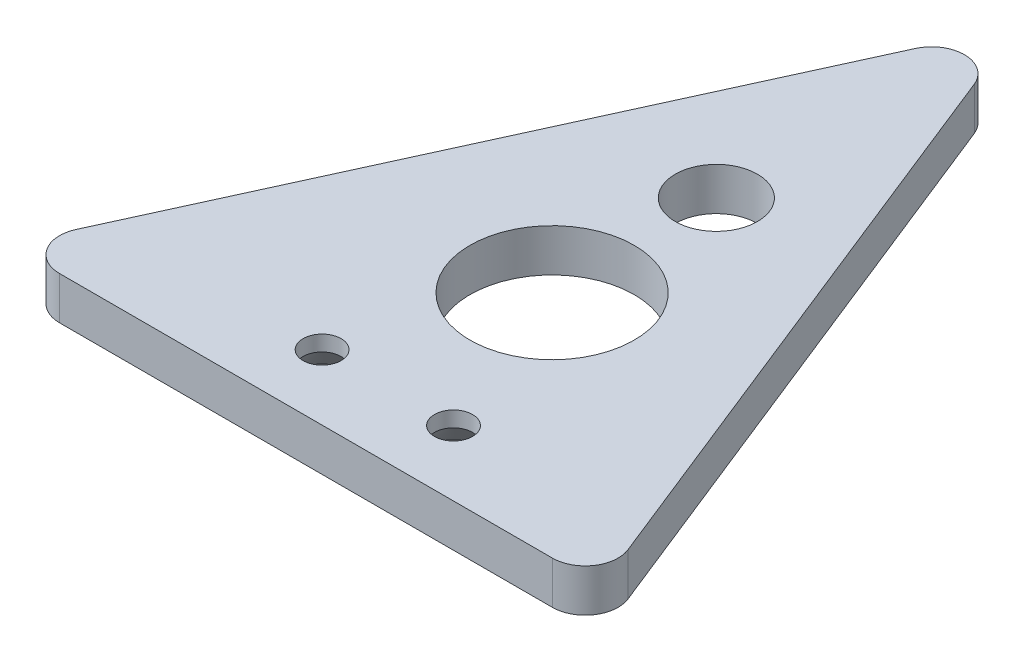
ISO-10303-21;
HEADER;
FILE_DESCRIPTION(('STEP AP214'),'2;1');
FILE_NAME('part.step','',(''),(''),'','','');
FILE_SCHEMA(('AUTOMOTIVE_DESIGN { 1 0 10303 214 1 1 1 1 }'));
ENDSEC;
DATA;
#1=APPLICATION_CONTEXT('core data for automotive mechanical design processes');
#2=APPLICATION_PROTOCOL_DEFINITION('international standard','automotive_design',2000,#1);
#3=PRODUCT_CONTEXT('',#1,'mechanical');
#4=PRODUCT('Part','Part','',(#3));
#5=PRODUCT_RELATED_PRODUCT_CATEGORY('part','',(#4));
#6=PRODUCT_DEFINITION_FORMATION('','',#4);
#7=PRODUCT_DEFINITION_CONTEXT('part definition',#1,'design');
#8=PRODUCT_DEFINITION('design','',#6,#7);
#9=PRODUCT_DEFINITION_SHAPE('','',#8);
#10=(LENGTH_UNIT() NAMED_UNIT(*) SI_UNIT(.MILLI.,.METRE.));
#11=(NAMED_UNIT(*) PLANE_ANGLE_UNIT() SI_UNIT($,.RADIAN.));
#12=(NAMED_UNIT(*) SI_UNIT($,.STERADIAN.) SOLID_ANGLE_UNIT());
#13=UNCERTAINTY_MEASURE_WITH_UNIT(LENGTH_MEASURE(1.E-05),#10,'distance_accuracy_value','');
#14=(GEOMETRIC_REPRESENTATION_CONTEXT(3) GLOBAL_UNCERTAINTY_ASSIGNED_CONTEXT((#13)) GLOBAL_UNIT_ASSIGNED_CONTEXT((#10,
#11,#12)) REPRESENTATION_CONTEXT('',''));
#15=CARTESIAN_POINT('',(0.,0.,0.));
#16=DIRECTION('',(0.,0.,1.));
#17=DIRECTION('',(1.,0.,0.));
#18=AXIS2_PLACEMENT_3D('',#15,#16,#17);
#19=CARTESIAN_POINT('',(-15.24,3.302,2.51460000000001));
#20=DIRECTION('',(0.,-1.,0.));
#21=DIRECTION('',(0.,0.,-1.));
#22=AXIS2_PLACEMENT_3D('',#19,#20,#21);
#23=PLANE('',#22);
#24=CARTESIAN_POINT('',(5.08,3.302,-25.4));
#25=DIRECTION('',(0.,-1.,0.));
#26=DIRECTION('',(0.,0.,-1.));
#27=AXIS2_PLACEMENT_3D('',#24,#25,#26);
#28=CIRCLE('',#27,3.175);
#29=CARTESIAN_POINT('',(5.08,3.302,-28.575));
#30=VERTEX_POINT('',#29);
#31=EDGE_CURVE('E187',#30,#30,#28,.T.);
#32=ORIENTED_EDGE('',*,*,#31,.T.);
#33=EDGE_LOOP('',(#32));
#34=FACE_BOUND('',#33,.T.);
#35=CARTESIAN_POINT('',(5.08,3.302,-12.7));
#36=DIRECTION('',(0.,-1.,0.));
#37=DIRECTION('',(0.,0.,-1.));
#38=AXIS2_PLACEMENT_3D('',#35,#36,#37);
#39=CIRCLE('',#38,6.35);
#40=CARTESIAN_POINT('',(5.08,3.302,-19.05));
#41=VERTEX_POINT('',#40);
#42=EDGE_CURVE('E195',#41,#41,#39,.T.);
#43=ORIENTED_EDGE('',*,*,#42,.T.);
#44=EDGE_LOOP('',(#43));
#45=FACE_BOUND('',#44,.T.);
#46=CARTESIAN_POINT('',(0.,3.302,0.));
#47=DIRECTION('',(0.,-1.,0.));
#48=DIRECTION('',(0.,0.,-1.));
#49=AXIS2_PLACEMENT_3D('',#46,#47,#48);
#50=CIRCLE('',#49,1.4732);
#51=CARTESIAN_POINT('',(0.,3.302,-1.4732));
#52=VERTEX_POINT('',#51);
#53=EDGE_CURVE('E206',#52,#52,#50,.T.);
#54=ORIENTED_EDGE('',*,*,#53,.T.);
#55=EDGE_LOOP('',(#54));
#56=FACE_BOUND('',#55,.T.);
#57=CARTESIAN_POINT('',(10.16,3.302,0.));
#58=DIRECTION('',(0.,-1.,0.));
#59=DIRECTION('',(0.,0.,-1.));
#60=AXIS2_PLACEMENT_3D('',#57,#58,#59);
#61=CIRCLE('',#60,1.4732);
#62=CARTESIAN_POINT('',(10.16,3.302,-1.4732));
#63=VERTEX_POINT('',#62);
#64=EDGE_CURVE('E122',#63,#63,#61,.T.);
#65=ORIENTED_EDGE('',*,*,#64,.T.);
#66=EDGE_LOOP('',(#65));
#67=FACE_BOUND('',#66,.T.);
#68=CARTESIAN_POINT('',(-15.24,3.302,2.51460000000001));
#69=DIRECTION('',(0.,1.,0.));
#70=DIRECTION('',(0.,0.,-1.));
#71=AXIS2_PLACEMENT_3D('',#68,#69,#70);
#72=CIRCLE('',#71,2.54);
#73=CARTESIAN_POINT('',(-17.5509752921642,3.302,1.46056337871648));
#74=VERTEX_POINT('',#73);
#75=CARTESIAN_POINT('',(-15.24,3.302,5.05460000000001));
#76=VERTEX_POINT('',#75);
#77=EDGE_CURVE('E129',#74,#76,#72,.T.);
#78=ORIENTED_EDGE('',*,*,#77,.T.);
#79=DIRECTION('',(1.,0.,0.));
#80=VECTOR('',#79,1.);
#81=CARTESIAN_POINT('',(22.86,3.302,5.05460000000001));
#82=LINE('',#81,#80);
#83=CARTESIAN_POINT('',(22.86,3.302,5.05460000000001));
#84=VERTEX_POINT('',#83);
#85=EDGE_CURVE('E88',#76,#84,#82,.T.);
#86=ORIENTED_EDGE('',*,*,#85,.T.);
#87=CARTESIAN_POINT('',(22.86,3.302,2.51460000000001));
#88=DIRECTION('',(0.,1.,0.));
#89=DIRECTION('',(0.,0.,-1.));
#90=AXIS2_PLACEMENT_3D('',#87,#88,#89);
#91=CIRCLE('',#90,2.54);
#92=CARTESIAN_POINT('',(25.2190721159599,3.302,1.57312310081419));
#93=VERTEX_POINT('',#92);
#94=EDGE_CURVE('E100',#84,#93,#91,.T.);
#95=ORIENTED_EDGE('',*,*,#94,.T.);
#96=DIRECTION('',(-0.370660196529849,0.,-0.928768549590507));
#97=VECTOR('',#96,1.);
#98=CARTESIAN_POINT('',(7.43907211595989,3.302,-42.9784768991858));
#99=LINE('',#98,#97);
#100=CARTESIAN_POINT('',(7.43907211595989,3.302,-42.9784768991858));
#101=VERTEX_POINT('',#100);
#102=EDGE_CURVE('E95',#93,#101,#99,.T.);
#103=ORIENTED_EDGE('',*,*,#102,.T.);
#104=CARTESIAN_POINT('',(5.08,3.302,-42.037));
#105=DIRECTION('',(0.,1.,0.));
#106=DIRECTION('',(0.,0.,1.));
#107=AXIS2_PLACEMENT_3D('',#104,#105,#106);
#108=CIRCLE('',#107,2.54000000000001);
#109=CARTESIAN_POINT('',(2.76902470783584,3.302,-43.0910366212835));
#110=VERTEX_POINT('',#109);
#111=EDGE_CURVE('E98',#101,#110,#108,.T.);
#112=ORIENTED_EDGE('',*,*,#111,.T.);
#113=DIRECTION('',(-0.414975047749423,0.,0.909832792190611));
#114=VECTOR('',#113,1.);
#115=CARTESIAN_POINT('',(-17.5509752921642,3.302,1.46056337871648));
#116=LINE('',#115,#114);
#117=EDGE_CURVE('E51',#110,#74,#116,.T.);
#118=ORIENTED_EDGE('',*,*,#117,.T.);
#119=EDGE_LOOP('',(#78,#86,#95,#103,#112,#118));
#120=FACE_BOUND('',#119,.T.);
#121=ADVANCED_FACE('F34',(#34,#45,#56,#67,#120),#23,.F.);
#122=CARTESIAN_POINT('',(-15.24,0.,2.51460000000001));
#123=DIRECTION('',(0.,-1.,0.));
#124=DIRECTION('',(0.,0.,-1.));
#125=AXIS2_PLACEMENT_3D('',#122,#123,#124);
#126=PLANE('',#125);
#127=CARTESIAN_POINT('',(5.08,0.,-25.4));
#128=DIRECTION('',(0.,-1.,0.));
#129=DIRECTION('',(0.,0.,-1.));
#130=AXIS2_PLACEMENT_3D('',#127,#128,#129);
#131=CIRCLE('',#130,3.175);
#132=CARTESIAN_POINT('',(5.08,0.,-28.575));
#133=VERTEX_POINT('',#132);
#134=EDGE_CURVE('E190',#133,#133,#131,.T.);
#135=ORIENTED_EDGE('',*,*,#134,.F.);
#136=EDGE_LOOP('',(#135));
#137=FACE_BOUND('',#136,.T.);
#138=CARTESIAN_POINT('',(5.08,0.,-12.7));
#139=DIRECTION('',(0.,-1.,0.));
#140=DIRECTION('',(0.,0.,-1.));
#141=AXIS2_PLACEMENT_3D('',#138,#139,#140);
#142=CIRCLE('',#141,6.35);
#143=CARTESIAN_POINT('',(5.08,0.,-19.05));
#144=VERTEX_POINT('',#143);
#145=EDGE_CURVE('E192',#144,#144,#142,.T.);
#146=ORIENTED_EDGE('',*,*,#145,.F.);
#147=EDGE_LOOP('',(#146));
#148=FACE_BOUND('',#147,.T.);
#149=CARTESIAN_POINT('',(0.,0.,0.));
#150=DIRECTION('',(0.,-1.,0.));
#151=DIRECTION('',(0.,0.,-1.));
#152=AXIS2_PLACEMENT_3D('',#149,#150,#151);
#153=CIRCLE('',#152,3.302);
#154=CARTESIAN_POINT('',(0.,0.,-3.302));
#155=VERTEX_POINT('',#154);
#156=EDGE_CURVE('E198',#155,#155,#153,.T.);
#157=ORIENTED_EDGE('',*,*,#156,.F.);
#158=EDGE_LOOP('',(#157));
#159=FACE_BOUND('',#158,.T.);
#160=CARTESIAN_POINT('',(10.16,0.,0.));
#161=DIRECTION('',(0.,-1.,0.));
#162=DIRECTION('',(0.,0.,-1.));
#163=AXIS2_PLACEMENT_3D('',#160,#161,#162);
#164=CIRCLE('',#163,3.302);
#165=CARTESIAN_POINT('',(10.16,0.,-3.302));
#166=VERTEX_POINT('',#165);
#167=EDGE_CURVE('E209',#166,#166,#164,.T.);
#168=ORIENTED_EDGE('',*,*,#167,.F.);
#169=EDGE_LOOP('',(#168));
#170=FACE_BOUND('',#169,.T.);
#171=CARTESIAN_POINT('',(-15.24,0.,2.51460000000001));
#172=DIRECTION('',(0.,1.,0.));
#173=DIRECTION('',(0.,0.,-1.));
#174=AXIS2_PLACEMENT_3D('',#171,#172,#173);
#175=CIRCLE('',#174,2.54);
#176=CARTESIAN_POINT('',(-17.5509752921642,0.,1.46056337871648));
#177=VERTEX_POINT('',#176);
#178=CARTESIAN_POINT('',(-15.24,0.,5.05460000000001));
#179=VERTEX_POINT('',#178);
#180=EDGE_CURVE('E118',#177,#179,#175,.T.);
#181=ORIENTED_EDGE('',*,*,#180,.F.);
#182=DIRECTION('',(-0.414975047749423,0.,0.909832792190611));
#183=VECTOR('',#182,1.);
#184=CARTESIAN_POINT('',(-17.5509752921642,0.,1.46056337871648));
#185=LINE('',#184,#183);
#186=CARTESIAN_POINT('',(2.76902470783584,0.,-43.0910366212835));
#187=VERTEX_POINT('',#186);
#188=EDGE_CURVE('E80',#187,#177,#185,.T.);
#189=ORIENTED_EDGE('',*,*,#188,.F.);
#190=CARTESIAN_POINT('',(5.08,0.,-42.037));
#191=DIRECTION('',(0.,1.,0.));
#192=DIRECTION('',(0.,0.,1.));
#193=AXIS2_PLACEMENT_3D('',#190,#191,#192);
#194=CIRCLE('',#193,2.54000000000001);
#195=CARTESIAN_POINT('',(7.43907211595989,0.,-42.9784768991858));
#196=VERTEX_POINT('',#195);
#197=EDGE_CURVE('E74',#196,#187,#194,.T.);
#198=ORIENTED_EDGE('',*,*,#197,.F.);
#199=DIRECTION('',(-0.370660196529849,0.,-0.928768549590507));
#200=VECTOR('',#199,1.);
#201=CARTESIAN_POINT('',(7.43907211595989,0.,-42.9784768991858));
#202=LINE('',#201,#200);
#203=CARTESIAN_POINT('',(25.2190721159599,0.,1.57312310081419));
#204=VERTEX_POINT('',#203);
#205=EDGE_CURVE('E108',#204,#196,#202,.T.);
#206=ORIENTED_EDGE('',*,*,#205,.F.);
#207=CARTESIAN_POINT('',(22.86,0.,2.51460000000001));
#208=DIRECTION('',(0.,1.,0.));
#209=DIRECTION('',(0.,0.,-1.));
#210=AXIS2_PLACEMENT_3D('',#207,#208,#209);
#211=CIRCLE('',#210,2.54);
#212=CARTESIAN_POINT('',(22.86,0.,5.05460000000001));
#213=VERTEX_POINT('',#212);
#214=EDGE_CURVE('E124',#213,#204,#211,.T.);
#215=ORIENTED_EDGE('',*,*,#214,.F.);
#216=DIRECTION('',(1.,0.,0.));
#217=VECTOR('',#216,1.);
#218=CARTESIAN_POINT('',(22.86,0.,5.05460000000001));
#219=LINE('',#218,#217);
#220=EDGE_CURVE('E121',#179,#213,#219,.T.);
#221=ORIENTED_EDGE('',*,*,#220,.F.);
#222=EDGE_LOOP('',(#181,#189,#198,#206,#215,#221));
#223=FACE_BOUND('',#222,.T.);
#224=ADVANCED_FACE('F138',(#137,#148,#159,#170,#223),#126,.T.);
#225=CARTESIAN_POINT('',(-15.24,3.302,2.51460000000001));
#226=DIRECTION('',(0.,-1.,0.));
#227=DIRECTION('',(0.,0.,-1.));
#228=AXIS2_PLACEMENT_3D('',#225,#226,#227);
#229=CYLINDRICAL_SURFACE('',#228,2.54);
#230=ORIENTED_EDGE('',*,*,#180,.T.);
#231=DIRECTION('',(0.,-1.,0.));
#232=VECTOR('',#231,1.);
#233=CARTESIAN_POINT('',(-15.24,3.302,5.05460000000001));
#234=LINE('',#233,#232);
#235=EDGE_CURVE('E11',#76,#179,#234,.T.);
#236=ORIENTED_EDGE('',*,*,#235,.F.);
#237=ORIENTED_EDGE('',*,*,#77,.F.);
#238=DIRECTION('',(0.,-1.,0.));
#239=VECTOR('',#238,1.);
#240=CARTESIAN_POINT('',(-17.5509752921642,3.302,1.46056337871648));
#241=LINE('',#240,#239);
#242=EDGE_CURVE('E114',#74,#177,#241,.T.);
#243=ORIENTED_EDGE('',*,*,#242,.T.);
#244=EDGE_LOOP('',(#230,#236,#237,#243));
#245=FACE_BOUND('',#244,.T.);
#246=ADVANCED_FACE('F36',(#245),#229,.T.);
#247=CARTESIAN_POINT('',(22.86,3.302,5.05460000000001));
#248=DIRECTION('',(0.,0.,-1.));
#249=DIRECTION('',(-1.,0.,0.));
#250=AXIS2_PLACEMENT_3D('',#247,#248,#249);
#251=PLANE('',#250);
#252=ORIENTED_EDGE('',*,*,#220,.T.);
#253=DIRECTION('',(0.,-1.,0.));
#254=VECTOR('',#253,1.);
#255=CARTESIAN_POINT('',(22.86,3.302,5.05460000000001));
#256=LINE('',#255,#254);
#257=EDGE_CURVE('E43',#84,#213,#256,.T.);
#258=ORIENTED_EDGE('',*,*,#257,.F.);
#259=ORIENTED_EDGE('',*,*,#85,.F.);
#260=ORIENTED_EDGE('',*,*,#235,.T.);
#261=EDGE_LOOP('',(#252,#258,#259,#260));
#262=FACE_BOUND('',#261,.T.);
#263=ADVANCED_FACE('F284',(#262),#251,.F.);
#264=CARTESIAN_POINT('',(22.86,3.302,2.51460000000001));
#265=DIRECTION('',(0.,-1.,0.));
#266=DIRECTION('',(0.,0.,-1.));
#267=AXIS2_PLACEMENT_3D('',#264,#265,#266);
#268=CYLINDRICAL_SURFACE('',#267,2.54);
#269=ORIENTED_EDGE('',*,*,#214,.T.);
#270=DIRECTION('',(0.,-1.,0.));
#271=VECTOR('',#270,1.);
#272=CARTESIAN_POINT('',(25.2190721159599,3.302,1.57312310081419));
#273=LINE('',#272,#271);
#274=EDGE_CURVE('E109',#93,#204,#273,.T.);
#275=ORIENTED_EDGE('',*,*,#274,.F.);
#276=ORIENTED_EDGE('',*,*,#94,.F.);
#277=ORIENTED_EDGE('',*,*,#257,.T.);
#278=EDGE_LOOP('',(#269,#275,#276,#277));
#279=FACE_BOUND('',#278,.T.);
#280=ADVANCED_FACE('F135',(#279),#268,.T.);
#281=CARTESIAN_POINT('',(7.43907211595989,3.302,-42.9784768991858));
#282=DIRECTION('',(-0.928768549590507,0.,0.370660196529849));
#283=DIRECTION('',(0.370660196529849,0.,0.928768549590507));
#284=AXIS2_PLACEMENT_3D('',#281,#282,#283);
#285=PLANE('',#284);
#286=ORIENTED_EDGE('',*,*,#205,.T.);
#287=DIRECTION('',(0.,-1.,0.));
#288=VECTOR('',#287,1.);
#289=CARTESIAN_POINT('',(7.43907211595989,3.302,-42.9784768991858));
#290=LINE('',#289,#288);
#291=EDGE_CURVE('E105',#101,#196,#290,.T.);
#292=ORIENTED_EDGE('',*,*,#291,.F.);
#293=ORIENTED_EDGE('',*,*,#102,.F.);
#294=ORIENTED_EDGE('',*,*,#274,.T.);
#295=EDGE_LOOP('',(#286,#292,#293,#294));
#296=FACE_BOUND('',#295,.T.);
#297=ADVANCED_FACE('F106',(#296),#285,.F.);
#298=CARTESIAN_POINT('',(5.08,3.302,-42.037));
#299=DIRECTION('',(0.,-1.,0.));
#300=DIRECTION('',(0.,0.,-1.));
#301=AXIS2_PLACEMENT_3D('',#298,#299,#300);
#302=CYLINDRICAL_SURFACE('',#301,2.54000000000001);
#303=ORIENTED_EDGE('',*,*,#197,.T.);
#304=DIRECTION('',(0.,-1.,0.));
#305=VECTOR('',#304,1.);
#306=CARTESIAN_POINT('',(2.76902470783584,3.302,-43.0910366212835));
#307=LINE('',#306,#305);
#308=EDGE_CURVE('E110',#110,#187,#307,.T.);
#309=ORIENTED_EDGE('',*,*,#308,.F.);
#310=ORIENTED_EDGE('',*,*,#111,.F.);
#311=ORIENTED_EDGE('',*,*,#291,.T.);
#312=EDGE_LOOP('',(#303,#309,#310,#311));
#313=FACE_BOUND('',#312,.T.);
#314=ADVANCED_FACE('F112',(#313),#302,.T.);
#315=CARTESIAN_POINT('',(-17.5509752921642,3.302,1.46056337871648));
#316=DIRECTION('',(0.909832792190611,0.,0.414975047749423));
#317=DIRECTION('',(0.414975047749423,0.,-0.909832792190611));
#318=AXIS2_PLACEMENT_3D('',#315,#316,#317);
#319=PLANE('',#318);
#320=ORIENTED_EDGE('',*,*,#188,.T.);
#321=ORIENTED_EDGE('',*,*,#242,.F.);
#322=ORIENTED_EDGE('',*,*,#117,.F.);
#323=ORIENTED_EDGE('',*,*,#308,.T.);
#324=EDGE_LOOP('',(#320,#321,#322,#323));
#325=FACE_BOUND('',#324,.T.);
#326=ADVANCED_FACE('F142',(#325),#319,.F.);
#327=CARTESIAN_POINT('',(10.16,0.,0.));
#328=DIRECTION('',(0.,-1.,0.));
#329=DIRECTION('',(0.,0.,-1.));
#330=AXIS2_PLACEMENT_3D('',#327,#328,#329);
#331=CYLINDRICAL_SURFACE('',#330,1.4732);
#332=ORIENTED_EDGE('',*,*,#64,.F.);
#333=EDGE_LOOP('',(#332));
#334=FACE_BOUND('',#333,.T.);
#335=CARTESIAN_POINT('',(10.16,2.10379374312578,0.));
#336=DIRECTION('',(0.,-1.,0.));
#337=DIRECTION('',(0.,0.,-1.));
#338=AXIS2_PLACEMENT_3D('',#335,#336,#337);
#339=CIRCLE('',#338,1.4732);
#340=CARTESIAN_POINT('',(10.16,2.10379374312578,-1.4732));
#341=VERTEX_POINT('',#340);
#342=EDGE_CURVE('E212',#341,#341,#339,.T.);
#343=ORIENTED_EDGE('',*,*,#342,.T.);
#344=EDGE_LOOP('',(#343));
#345=FACE_BOUND('',#344,.T.);
#346=ADVANCED_FACE('F144',(#334,#345),#331,.F.);
#347=CARTESIAN_POINT('',(10.16,0.,0.));
#348=DIRECTION('',(0.,-1.,0.));
#349=DIRECTION('',(0.,0.,-1.));
#350=AXIS2_PLACEMENT_3D('',#347,#348,#349);
#351=CONICAL_SURFACE('',#350,3.302,0.715584993317675);
#352=ORIENTED_EDGE('',*,*,#342,.F.);
#353=EDGE_LOOP('',(#352));
#354=FACE_BOUND('',#353,.T.);
#355=ORIENTED_EDGE('',*,*,#167,.T.);
#356=EDGE_LOOP('',(#355));
#357=FACE_BOUND('',#356,.T.);
#358=ADVANCED_FACE('F150',(#354,#357),#351,.F.);
#359=CARTESIAN_POINT('',(0.,0.,0.));
#360=DIRECTION('',(0.,-1.,0.));
#361=DIRECTION('',(0.,0.,-1.));
#362=AXIS2_PLACEMENT_3D('',#359,#360,#361);
#363=CYLINDRICAL_SURFACE('',#362,1.4732);
#364=ORIENTED_EDGE('',*,*,#53,.F.);
#365=EDGE_LOOP('',(#364));
#366=FACE_BOUND('',#365,.T.);
#367=CARTESIAN_POINT('',(0.,2.10379374312578,0.));
#368=DIRECTION('',(0.,-1.,0.));
#369=DIRECTION('',(0.,0.,-1.));
#370=AXIS2_PLACEMENT_3D('',#367,#368,#369);
#371=CIRCLE('',#370,1.4732);
#372=CARTESIAN_POINT('',(0.,2.10379374312578,-1.4732));
#373=VERTEX_POINT('',#372);
#374=EDGE_CURVE('E203',#373,#373,#371,.T.);
#375=ORIENTED_EDGE('',*,*,#374,.T.);
#376=EDGE_LOOP('',(#375));
#377=FACE_BOUND('',#376,.T.);
#378=ADVANCED_FACE('F167',(#366,#377),#363,.F.);
#379=CARTESIAN_POINT('',(0.,0.,0.));
#380=DIRECTION('',(0.,-1.,0.));
#381=DIRECTION('',(0.,0.,-1.));
#382=AXIS2_PLACEMENT_3D('',#379,#380,#381);
#383=CONICAL_SURFACE('',#382,3.302,0.715584993317675);
#384=ORIENTED_EDGE('',*,*,#374,.F.);
#385=EDGE_LOOP('',(#384));
#386=FACE_BOUND('',#385,.T.);
#387=ORIENTED_EDGE('',*,*,#156,.T.);
#388=EDGE_LOOP('',(#387));
#389=FACE_BOUND('',#388,.T.);
#390=ADVANCED_FACE('F171',(#386,#389),#383,.F.);
#391=CARTESIAN_POINT('',(5.08,3.302,-12.7));
#392=DIRECTION('',(0.,-1.,0.));
#393=DIRECTION('',(0.,0.,-1.));
#394=AXIS2_PLACEMENT_3D('',#391,#392,#393);
#395=CYLINDRICAL_SURFACE('',#394,6.35);
#396=CARTESIAN_POINT('',(5.08,3.302,-19.05));
#397=CARTESIAN_POINT('',(5.08,3.26760416666667,-19.05));
#398=CARTESIAN_POINT('',(5.08,3.23320833333333,-19.05));
#399=CARTESIAN_POINT('',(5.08,3.16441666666667,-19.05));
#400=CARTESIAN_POINT('',(5.08,3.13002083333333,-19.05));
#401=CARTESIAN_POINT('',(5.08,3.06122916666667,-19.05));
#402=CARTESIAN_POINT('',(5.08,3.02683333333333,-19.05));
#403=CARTESIAN_POINT('',(5.08,2.95804166666667,-19.05));
#404=CARTESIAN_POINT('',(5.08,2.92364583333333,-19.05));
#405=CARTESIAN_POINT('',(5.08,2.85485416666667,-19.05));
#406=CARTESIAN_POINT('',(5.08,2.82045833333333,-19.05));
#407=CARTESIAN_POINT('',(5.08,2.75166666666667,-19.05));
#408=CARTESIAN_POINT('',(5.08,2.71727083333333,-19.05));
#409=CARTESIAN_POINT('',(5.08,2.64847916666667,-19.05));
#410=CARTESIAN_POINT('',(5.08,2.61408333333333,-19.05));
#411=CARTESIAN_POINT('',(5.08,2.54529166666667,-19.05));
#412=CARTESIAN_POINT('',(5.08,2.51089583333333,-19.05));
#413=CARTESIAN_POINT('',(5.08,2.44210416666667,-19.05));
#414=CARTESIAN_POINT('',(5.08,2.40770833333333,-19.05));
#415=CARTESIAN_POINT('',(5.08,2.33891666666667,-19.05));
#416=CARTESIAN_POINT('',(5.08,2.30452083333333,-19.05));
#417=CARTESIAN_POINT('',(5.08,2.23572916666667,-19.05));
#418=CARTESIAN_POINT('',(5.08,2.20133333333333,-19.05));
#419=CARTESIAN_POINT('',(5.08,2.13254166666667,-19.05));
#420=CARTESIAN_POINT('',(5.08,2.09814583333333,-19.05));
#421=CARTESIAN_POINT('',(5.08,2.02935416666667,-19.05));
#422=CARTESIAN_POINT('',(5.08,1.99495833333333,-19.05));
#423=CARTESIAN_POINT('',(5.08,1.92616666666667,-19.05));
#424=CARTESIAN_POINT('',(5.08,1.89177083333333,-19.05));
#425=CARTESIAN_POINT('',(5.08,1.82297916666667,-19.05));
#426=CARTESIAN_POINT('',(5.08,1.78858333333333,-19.05));
#427=CARTESIAN_POINT('',(5.08,1.71979166666667,-19.05));
#428=CARTESIAN_POINT('',(5.08,1.68539583333333,-19.05));
#429=CARTESIAN_POINT('',(5.08,1.61660416666667,-19.05));
#430=CARTESIAN_POINT('',(5.08,1.58220833333333,-19.05));
#431=CARTESIAN_POINT('',(5.08,1.51341666666667,-19.05));
#432=CARTESIAN_POINT('',(5.08,1.47902083333333,-19.05));
#433=CARTESIAN_POINT('',(5.08,1.41022916666667,-19.05));
#434=CARTESIAN_POINT('',(5.08,1.37583333333333,-19.05));
#435=CARTESIAN_POINT('',(5.08,1.30704166666667,-19.05));
#436=CARTESIAN_POINT('',(5.08,1.27264583333333,-19.05));
#437=CARTESIAN_POINT('',(5.08,1.20385416666667,-19.05));
#438=CARTESIAN_POINT('',(5.08,1.16945833333333,-19.05));
#439=CARTESIAN_POINT('',(5.08,1.10066666666667,-19.05));
#440=CARTESIAN_POINT('',(5.08,1.06627083333333,-19.05));
#441=CARTESIAN_POINT('',(5.08,0.997479166666667,-19.05));
#442=CARTESIAN_POINT('',(5.08,0.963083333333334,-19.05));
#443=CARTESIAN_POINT('',(5.08,0.894291666666667,-19.05));
#444=CARTESIAN_POINT('',(5.08,0.859895833333333,-19.05));
#445=CARTESIAN_POINT('',(5.08,0.791104166666666,-19.05));
#446=CARTESIAN_POINT('',(5.08,0.756708333333333,-19.05));
#447=CARTESIAN_POINT('',(5.08,0.687916666666667,-19.05));
#448=CARTESIAN_POINT('',(5.08,0.653520833333333,-19.05));
#449=CARTESIAN_POINT('',(5.08,0.584729166666667,-19.05));
#450=CARTESIAN_POINT('',(5.08,0.550333333333333,-19.05));
#451=CARTESIAN_POINT('',(5.08,0.481541666666667,-19.05));
#452=CARTESIAN_POINT('',(5.08,0.447145833333333,-19.05));
#453=CARTESIAN_POINT('',(5.08,0.378354166666667,-19.05));
#454=CARTESIAN_POINT('',(5.08,0.343958333333333,-19.05));
#455=CARTESIAN_POINT('',(5.08,0.275166666666667,-19.05));
#456=CARTESIAN_POINT('',(5.08,0.240770833333333,-19.05));
#457=CARTESIAN_POINT('',(5.08,0.171979166666667,-19.05));
#458=CARTESIAN_POINT('',(5.08,0.137583333333333,-19.05));
#459=CARTESIAN_POINT('',(5.08,0.0687916666666666,-19.05));
#460=CARTESIAN_POINT('',(5.08,0.0343958333333333,-19.05));
#461=CARTESIAN_POINT('',(5.08,0.,-19.05));
#462=B_SPLINE_CURVE_WITH_KNOTS('',3,(#396,#397,#398,#399,#400,#401,#402,#403,#404,#405,#406,
#407,#408,#409,#410,#411,#412,#413,#414,#415,#416,#417,#418,#419,#420,#421,#422,#423,#424,#425,
#426,#427,#428,#429,#430,#431,#432,#433,#434,#435,#436,#437,#438,#439,#440,#441,#442,#443,#444,
#445,#446,#447,#448,#449,#450,#451,#452,#453,#454,#455,#456,#457,#458,#459,#460,#461),
.UNSPECIFIED.,.F.,.F.,(4,2,2,2,2,2,2,2,2,2,2,2,2,2,2,2,2,2,2,2,2,2,2,2,2,2,2,2,2,2,2,2,4),(0.,
0.1031875,0.206375,0.3095625,0.41275,0.515937499999999,0.619125,0.7223125,0.8255,0.9286875,
1.031875,1.1350625,1.23825,1.3414375,1.444625,1.5478125,1.651,1.7541875,1.857375,1.9605625,
2.06375,2.1669375,2.270125,2.3733125,2.4765,2.5796875,2.682875,2.7860625,2.88925,2.9924375,
3.095625,3.1988125,3.302),.UNSPECIFIED.);
#463=EDGE_CURVE('BSEAM175',#41,#144,#462,.T.);
#464=ORIENTED_EDGE('',*,*,#42,.F.);
#465=ORIENTED_EDGE('',*,*,#145,.T.);
#466=ORIENTED_EDGE('',*,*,#463,.T.);
#467=ORIENTED_EDGE('',*,*,#463,.F.);
#468=EDGE_LOOP('',(#464,#466,#465,#467));
#469=FACE_BOUND('',#468,.T.);
#470=ADVANCED_FACE('F175',(#469),#395,.F.);
#471=CARTESIAN_POINT('',(5.08,3.302,-25.4));
#472=DIRECTION('',(0.,-1.,0.));
#473=DIRECTION('',(0.,0.,-1.));
#474=AXIS2_PLACEMENT_3D('',#471,#472,#473);
#475=CYLINDRICAL_SURFACE('',#474,3.175);
#476=CARTESIAN_POINT('',(5.08,3.302,-28.575));
#477=CARTESIAN_POINT('',(5.08,3.26760416666667,-28.575));
#478=CARTESIAN_POINT('',(5.08,3.23320833333333,-28.575));
#479=CARTESIAN_POINT('',(5.08,3.16441666666667,-28.575));
#480=CARTESIAN_POINT('',(5.08,3.13002083333333,-28.575));
#481=CARTESIAN_POINT('',(5.08,3.06122916666667,-28.575));
#482=CARTESIAN_POINT('',(5.08,3.02683333333333,-28.575));
#483=CARTESIAN_POINT('',(5.08,2.95804166666667,-28.575));
#484=CARTESIAN_POINT('',(5.08,2.92364583333333,-28.575));
#485=CARTESIAN_POINT('',(5.08,2.85485416666667,-28.575));
#486=CARTESIAN_POINT('',(5.08,2.82045833333333,-28.575));
#487=CARTESIAN_POINT('',(5.08,2.75166666666667,-28.575));
#488=CARTESIAN_POINT('',(5.08,2.71727083333333,-28.575));
#489=CARTESIAN_POINT('',(5.08,2.64847916666667,-28.575));
#490=CARTESIAN_POINT('',(5.08,2.61408333333333,-28.575));
#491=CARTESIAN_POINT('',(5.08,2.54529166666667,-28.575));
#492=CARTESIAN_POINT('',(5.08,2.51089583333333,-28.575));
#493=CARTESIAN_POINT('',(5.08,2.44210416666667,-28.575));
#494=CARTESIAN_POINT('',(5.08,2.40770833333333,-28.575));
#495=CARTESIAN_POINT('',(5.08,2.33891666666667,-28.575));
#496=CARTESIAN_POINT('',(5.08,2.30452083333333,-28.575));
#497=CARTESIAN_POINT('',(5.08,2.23572916666667,-28.575));
#498=CARTESIAN_POINT('',(5.08,2.20133333333333,-28.575));
#499=CARTESIAN_POINT('',(5.08,2.13254166666667,-28.575));
#500=CARTESIAN_POINT('',(5.08,2.09814583333333,-28.575));
#501=CARTESIAN_POINT('',(5.08,2.02935416666667,-28.575));
#502=CARTESIAN_POINT('',(5.08,1.99495833333333,-28.575));
#503=CARTESIAN_POINT('',(5.08,1.92616666666667,-28.575));
#504=CARTESIAN_POINT('',(5.08,1.89177083333333,-28.575));
#505=CARTESIAN_POINT('',(5.08,1.82297916666667,-28.575));
#506=CARTESIAN_POINT('',(5.08,1.78858333333333,-28.575));
#507=CARTESIAN_POINT('',(5.08,1.71979166666667,-28.575));
#508=CARTESIAN_POINT('',(5.08,1.68539583333333,-28.575));
#509=CARTESIAN_POINT('',(5.08,1.61660416666667,-28.575));
#510=CARTESIAN_POINT('',(5.08,1.58220833333333,-28.575));
#511=CARTESIAN_POINT('',(5.08,1.51341666666667,-28.575));
#512=CARTESIAN_POINT('',(5.08,1.47902083333333,-28.575));
#513=CARTESIAN_POINT('',(5.08,1.41022916666667,-28.575));
#514=CARTESIAN_POINT('',(5.08,1.37583333333333,-28.575));
#515=CARTESIAN_POINT('',(5.08,1.30704166666667,-28.575));
#516=CARTESIAN_POINT('',(5.08,1.27264583333333,-28.575));
#517=CARTESIAN_POINT('',(5.08,1.20385416666667,-28.575));
#518=CARTESIAN_POINT('',(5.08,1.16945833333333,-28.575));
#519=CARTESIAN_POINT('',(5.08,1.10066666666667,-28.575));
#520=CARTESIAN_POINT('',(5.08,1.06627083333333,-28.575));
#521=CARTESIAN_POINT('',(5.08,0.997479166666667,-28.575));
#522=CARTESIAN_POINT('',(5.08,0.963083333333334,-28.575));
#523=CARTESIAN_POINT('',(5.08,0.894291666666667,-28.575));
#524=CARTESIAN_POINT('',(5.08,0.859895833333333,-28.575));
#525=CARTESIAN_POINT('',(5.08,0.791104166666666,-28.575));
#526=CARTESIAN_POINT('',(5.08,0.756708333333333,-28.575));
#527=CARTESIAN_POINT('',(5.08,0.687916666666667,-28.575));
#528=CARTESIAN_POINT('',(5.08,0.653520833333333,-28.575));
#529=CARTESIAN_POINT('',(5.08,0.584729166666667,-28.575));
#530=CARTESIAN_POINT('',(5.08,0.550333333333333,-28.575));
#531=CARTESIAN_POINT('',(5.08,0.481541666666667,-28.575));
#532=CARTESIAN_POINT('',(5.08,0.447145833333333,-28.575));
#533=CARTESIAN_POINT('',(5.08,0.378354166666667,-28.575));
#534=CARTESIAN_POINT('',(5.08,0.343958333333333,-28.575));
#535=CARTESIAN_POINT('',(5.08,0.275166666666667,-28.575));
#536=CARTESIAN_POINT('',(5.08,0.240770833333333,-28.575));
#537=CARTESIAN_POINT('',(5.08,0.171979166666667,-28.575));
#538=CARTESIAN_POINT('',(5.08,0.137583333333333,-28.575));
#539=CARTESIAN_POINT('',(5.08,0.0687916666666666,-28.575));
#540=CARTESIAN_POINT('',(5.08,0.0343958333333333,-28.575));
#541=CARTESIAN_POINT('',(5.08,0.,-28.575));
#542=B_SPLINE_CURVE_WITH_KNOTS('',3,(#476,#477,#478,#479,#480,#481,#482,#483,#484,#485,#486,
#487,#488,#489,#490,#491,#492,#493,#494,#495,#496,#497,#498,#499,#500,#501,#502,#503,#504,#505,
#506,#507,#508,#509,#510,#511,#512,#513,#514,#515,#516,#517,#518,#519,#520,#521,#522,#523,#524,
#525,#526,#527,#528,#529,#530,#531,#532,#533,#534,#535,#536,#537,#538,#539,#540,#541),
.UNSPECIFIED.,.F.,.F.,(4,2,2,2,2,2,2,2,2,2,2,2,2,2,2,2,2,2,2,2,2,2,2,2,2,2,2,2,2,2,2,2,4),(0.,
0.1031875,0.206375,0.3095625,0.41275,0.515937499999999,0.619125,0.7223125,0.8255,0.9286875,
1.031875,1.1350625,1.23825,1.3414375,1.444625,1.5478125,1.651,1.7541875,1.857375,1.9605625,
2.06375,2.1669375,2.270125,2.3733125,2.4765,2.5796875,2.682875,2.7860625,2.88925,2.9924375,
3.095625,3.1988125,3.302),.UNSPECIFIED.);
#543=EDGE_CURVE('BSEAM179',#30,#133,#542,.T.);
#544=ORIENTED_EDGE('',*,*,#31,.F.);
#545=ORIENTED_EDGE('',*,*,#134,.T.);
#546=ORIENTED_EDGE('',*,*,#543,.T.);
#547=ORIENTED_EDGE('',*,*,#543,.F.);
#548=EDGE_LOOP('',(#544,#546,#545,#547));
#549=FACE_BOUND('',#548,.T.);
#550=ADVANCED_FACE('F179',(#549),#475,.F.);
#551=CLOSED_SHELL('',(#121,#224,#246,#263,#280,#297,#314,#326,#346,#358,#378,#390,#470,#550));
#552=MANIFOLD_SOLID_BREP('B2',#551);
#553=ADVANCED_BREP_SHAPE_REPRESENTATION('',(#18,#552),#14);
#554=SHAPE_DEFINITION_REPRESENTATION(#9,#553);
ENDSEC;
END-ISO-10303-21;
